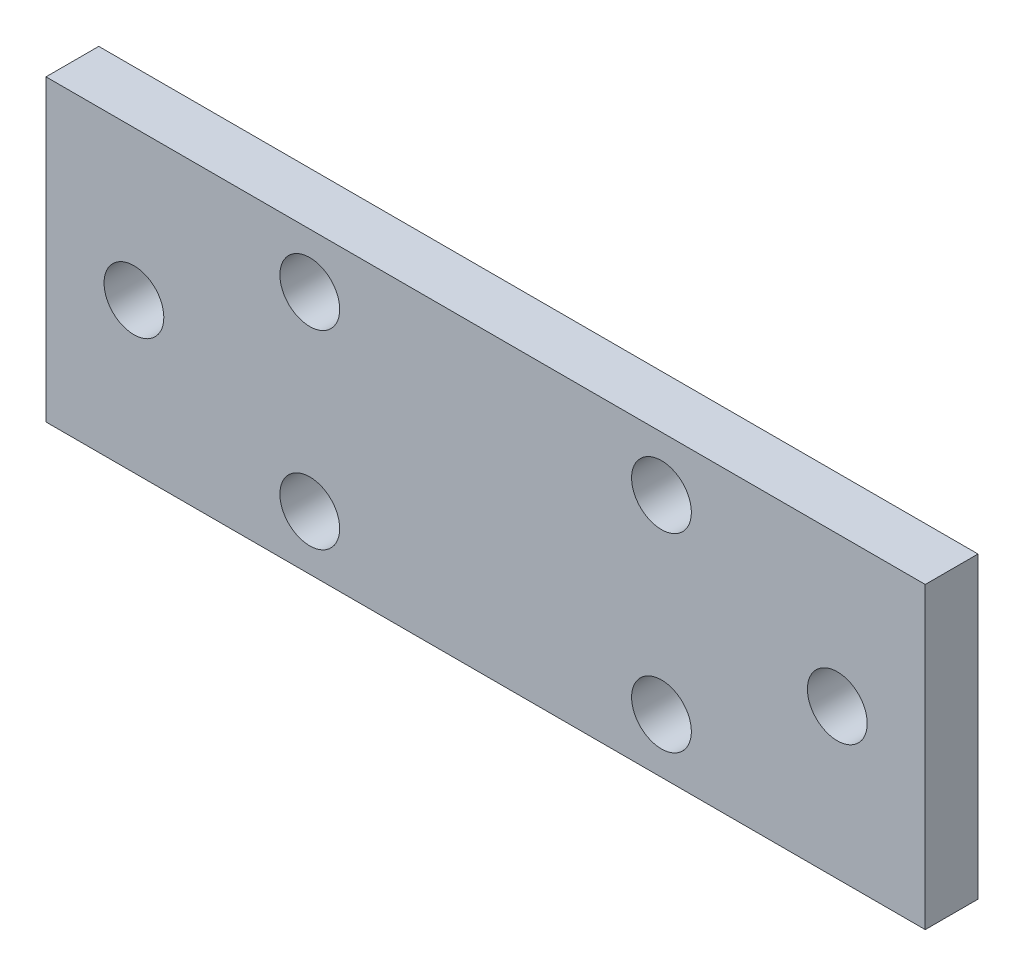
ISO-10303-21;
HEADER;
FILE_DESCRIPTION(('STEP AP214'),'2;1');
FILE_NAME('part.step','',(''),(''),'','','');
FILE_SCHEMA(('AUTOMOTIVE_DESIGN { 1 0 10303 214 1 1 1 1 }'));
ENDSEC;
DATA;
#1=APPLICATION_CONTEXT('core data for automotive mechanical design processes');
#2=APPLICATION_PROTOCOL_DEFINITION('international standard','automotive_design',2000,#1);
#3=PRODUCT_CONTEXT('',#1,'mechanical');
#4=PRODUCT('Part','Part','',(#3));
#5=PRODUCT_RELATED_PRODUCT_CATEGORY('part','',(#4));
#6=PRODUCT_DEFINITION_FORMATION('','',#4);
#7=PRODUCT_DEFINITION_CONTEXT('part definition',#1,'design');
#8=PRODUCT_DEFINITION('design','',#6,#7);
#9=PRODUCT_DEFINITION_SHAPE('','',#8);
#10=(LENGTH_UNIT() NAMED_UNIT(*) SI_UNIT(.MILLI.,.METRE.));
#11=(NAMED_UNIT(*) PLANE_ANGLE_UNIT() SI_UNIT($,.RADIAN.));
#12=(NAMED_UNIT(*) SI_UNIT($,.STERADIAN.) SOLID_ANGLE_UNIT());
#13=UNCERTAINTY_MEASURE_WITH_UNIT(LENGTH_MEASURE(1.E-05),#10,'distance_accuracy_value','');
#14=(GEOMETRIC_REPRESENTATION_CONTEXT(3) GLOBAL_UNCERTAINTY_ASSIGNED_CONTEXT((#13)) GLOBAL_UNIT_ASSIGNED_CONTEXT((#10,
#11,#12)) REPRESENTATION_CONTEXT('',''));
#15=CARTESIAN_POINT('',(0.,0.,0.));
#16=DIRECTION('',(0.,0.,1.));
#17=DIRECTION('',(1.,0.,0.));
#18=AXIS2_PLACEMENT_3D('',#15,#16,#17);
#19=CARTESIAN_POINT('',(-10.,5.4,1.5));
#20=DIRECTION('',(0.,0.,1.));
#21=DIRECTION('',(-1.,0.,0.));
#22=AXIS2_PLACEMENT_3D('',#19,#20,#21);
#23=CYLINDRICAL_SURFACE('',#22,1.7);
#24=CARTESIAN_POINT('',(-10.,5.4,-1.5));
#25=DIRECTION('',(0.,0.,1.));
#26=DIRECTION('',(-1.,0.,0.));
#27=AXIS2_PLACEMENT_3D('',#24,#25,#26);
#28=CIRCLE('',#27,1.7);
#29=CARTESIAN_POINT('',(-8.3,5.4,-1.5));
#30=VERTEX_POINT('',#29);
#31=EDGE_CURVE('E179',#30,#30,#28,.T.);
#32=ORIENTED_EDGE('',*,*,#31,.F.);
#33=DIRECTION('',(0.,0.,1.));
#34=VECTOR('',#33,1.);
#35=CARTESIAN_POINT('',(-8.3,5.4,1.5));
#36=LINE('',#35,#34);
#37=CARTESIAN_POINT('',(-8.3,5.4,1.5));
#38=VERTEX_POINT('',#37);
#39=EDGE_CURVE('E11',#30,#38,#36,.T.);
#40=ORIENTED_EDGE('',*,*,#39,.T.);
#41=CARTESIAN_POINT('',(-10.,5.4,1.5));
#42=DIRECTION('',(0.,0.,1.));
#43=DIRECTION('',(-1.,0.,0.));
#44=AXIS2_PLACEMENT_3D('',#41,#42,#43);
#45=CIRCLE('',#44,1.7);
#46=EDGE_CURVE('E201',#38,#38,#45,.T.);
#47=ORIENTED_EDGE('',*,*,#46,.T.);
#48=ORIENTED_EDGE('',*,*,#39,.F.);
#49=EDGE_LOOP('',(#32,#40,#47,#48));
#50=FACE_BOUND('',#49,.T.);
#51=ADVANCED_FACE('F17',(#50),#23,.F.);
#52=CARTESIAN_POINT('',(10.,5.4,1.5));
#53=DIRECTION('',(0.,0.,1.));
#54=DIRECTION('',(-1.,0.,0.));
#55=AXIS2_PLACEMENT_3D('',#52,#53,#54);
#56=CYLINDRICAL_SURFACE('',#55,1.7);
#57=CARTESIAN_POINT('',(10.,5.4,-1.5));
#58=DIRECTION('',(0.,0.,1.));
#59=DIRECTION('',(-1.,0.,0.));
#60=AXIS2_PLACEMENT_3D('',#57,#58,#59);
#61=CIRCLE('',#60,1.7);
#62=CARTESIAN_POINT('',(11.7,5.4,-1.5));
#63=VERTEX_POINT('',#62);
#64=EDGE_CURVE('E167',#63,#63,#61,.T.);
#65=ORIENTED_EDGE('',*,*,#64,.F.);
#66=DIRECTION('',(0.,0.,1.));
#67=VECTOR('',#66,1.);
#68=CARTESIAN_POINT('',(11.7,5.4,1.5));
#69=LINE('',#68,#67);
#70=CARTESIAN_POINT('',(11.7,5.4,1.5));
#71=VERTEX_POINT('',#70);
#72=EDGE_CURVE('E28',#63,#71,#69,.T.);
#73=ORIENTED_EDGE('',*,*,#72,.T.);
#74=CARTESIAN_POINT('',(10.,5.4,1.5));
#75=DIRECTION('',(0.,0.,1.));
#76=DIRECTION('',(-1.,0.,0.));
#77=AXIS2_PLACEMENT_3D('',#74,#75,#76);
#78=CIRCLE('',#77,1.7);
#79=EDGE_CURVE('E198',#71,#71,#78,.T.);
#80=ORIENTED_EDGE('',*,*,#79,.T.);
#81=ORIENTED_EDGE('',*,*,#72,.F.);
#82=EDGE_LOOP('',(#65,#73,#80,#81));
#83=FACE_BOUND('',#82,.T.);
#84=ADVANCED_FACE('F273',(#83),#56,.F.);
#85=CARTESIAN_POINT('',(-10.,-5.4,1.5));
#86=DIRECTION('',(0.,0.,-1.));
#87=DIRECTION('',(-1.,0.,0.));
#88=AXIS2_PLACEMENT_3D('',#85,#86,#87);
#89=CYLINDRICAL_SURFACE('',#88,1.7);
#90=CARTESIAN_POINT('',(-10.,-5.4,1.5));
#91=DIRECTION('',(0.,0.,-1.));
#92=DIRECTION('',(-1.,0.,0.));
#93=AXIS2_PLACEMENT_3D('',#90,#91,#92);
#94=CIRCLE('',#93,1.7);
#95=CARTESIAN_POINT('',(-8.3,-5.4,1.5));
#96=VERTEX_POINT('',#95);
#97=EDGE_CURVE('E197',#96,#96,#94,.T.);
#98=ORIENTED_EDGE('',*,*,#97,.F.);
#99=DIRECTION('',(0.,0.,-1.));
#100=VECTOR('',#99,1.);
#101=CARTESIAN_POINT('',(-8.3,-5.4,1.5));
#102=LINE('',#101,#100);
#103=CARTESIAN_POINT('',(-8.3,-5.4,-1.5));
#104=VERTEX_POINT('',#103);
#105=EDGE_CURVE('E21',#96,#104,#102,.T.);
#106=ORIENTED_EDGE('',*,*,#105,.T.);
#107=CARTESIAN_POINT('',(-10.,-5.4,-1.5));
#108=DIRECTION('',(0.,0.,-1.));
#109=DIRECTION('',(-1.,0.,0.));
#110=AXIS2_PLACEMENT_3D('',#107,#108,#109);
#111=CIRCLE('',#110,1.7);
#112=EDGE_CURVE('E163',#104,#104,#111,.T.);
#113=ORIENTED_EDGE('',*,*,#112,.T.);
#114=ORIENTED_EDGE('',*,*,#105,.F.);
#115=EDGE_LOOP('',(#98,#106,#113,#114));
#116=FACE_BOUND('',#115,.T.);
#117=ADVANCED_FACE('F277',(#116),#89,.F.);
#118=CARTESIAN_POINT('',(10.,-5.4,1.5));
#119=DIRECTION('',(0.,0.,-1.));
#120=DIRECTION('',(-1.,0.,0.));
#121=AXIS2_PLACEMENT_3D('',#118,#119,#120);
#122=CYLINDRICAL_SURFACE('',#121,1.7);
#123=CARTESIAN_POINT('',(10.,-5.4,1.5));
#124=DIRECTION('',(0.,0.,-1.));
#125=DIRECTION('',(-1.,0.,0.));
#126=AXIS2_PLACEMENT_3D('',#123,#124,#125);
#127=CIRCLE('',#126,1.7);
#128=CARTESIAN_POINT('',(11.7,-5.4,1.5));
#129=VERTEX_POINT('',#128);
#130=EDGE_CURVE('E142',#129,#129,#127,.T.);
#131=ORIENTED_EDGE('',*,*,#130,.F.);
#132=DIRECTION('',(0.,0.,-1.));
#133=VECTOR('',#132,1.);
#134=CARTESIAN_POINT('',(11.7,-5.4,1.5));
#135=LINE('',#134,#133);
#136=CARTESIAN_POINT('',(11.7,-5.4,-1.5));
#137=VERTEX_POINT('',#136);
#138=EDGE_CURVE('E123',#129,#137,#135,.T.);
#139=ORIENTED_EDGE('',*,*,#138,.T.);
#140=CARTESIAN_POINT('',(10.,-5.4,-1.5));
#141=DIRECTION('',(0.,0.,-1.));
#142=DIRECTION('',(-1.,0.,0.));
#143=AXIS2_PLACEMENT_3D('',#140,#141,#142);
#144=CIRCLE('',#143,1.7);
#145=EDGE_CURVE('E141',#137,#137,#144,.T.);
#146=ORIENTED_EDGE('',*,*,#145,.T.);
#147=ORIENTED_EDGE('',*,*,#138,.F.);
#148=EDGE_LOOP('',(#131,#139,#146,#147));
#149=FACE_BOUND('',#148,.T.);
#150=ADVANCED_FACE('F139',(#149),#122,.F.);
#151=CARTESIAN_POINT('',(-20.,0.,1.5));
#152=DIRECTION('',(0.,0.,-1.));
#153=DIRECTION('',(-1.,0.,0.));
#154=AXIS2_PLACEMENT_3D('',#151,#152,#153);
#155=CYLINDRICAL_SURFACE('',#154,1.7);
#156=CARTESIAN_POINT('',(-20.,0.,1.5));
#157=DIRECTION('',(0.,0.,-1.));
#158=DIRECTION('',(-1.,0.,0.));
#159=AXIS2_PLACEMENT_3D('',#156,#157,#158);
#160=CIRCLE('',#159,1.7);
#161=CARTESIAN_POINT('',(-18.3,0.,1.5));
#162=VERTEX_POINT('',#161);
#163=EDGE_CURVE('E152',#162,#162,#160,.T.);
#164=ORIENTED_EDGE('',*,*,#163,.F.);
#165=DIRECTION('',(0.,0.,-1.));
#166=VECTOR('',#165,1.);
#167=CARTESIAN_POINT('',(-18.3,0.,1.5));
#168=LINE('',#167,#166);
#169=CARTESIAN_POINT('',(-18.3,0.,-1.5));
#170=VERTEX_POINT('',#169);
#171=EDGE_CURVE('E135',#162,#170,#168,.T.);
#172=ORIENTED_EDGE('',*,*,#171,.T.);
#173=CARTESIAN_POINT('',(-20.,0.,-1.5));
#174=DIRECTION('',(0.,0.,-1.));
#175=DIRECTION('',(-1.,0.,0.));
#176=AXIS2_PLACEMENT_3D('',#173,#174,#175);
#177=CIRCLE('',#176,1.7);
#178=EDGE_CURVE('E159',#170,#170,#177,.T.);
#179=ORIENTED_EDGE('',*,*,#178,.T.);
#180=ORIENTED_EDGE('',*,*,#171,.F.);
#181=EDGE_LOOP('',(#164,#172,#179,#180));
#182=FACE_BOUND('',#181,.T.);
#183=ADVANCED_FACE('F268',(#182),#155,.F.);
#184=CARTESIAN_POINT('',(20.,0.,1.5));
#185=DIRECTION('',(0.,0.,-1.));
#186=DIRECTION('',(-1.,0.,0.));
#187=AXIS2_PLACEMENT_3D('',#184,#185,#186);
#188=CYLINDRICAL_SURFACE('',#187,1.7);
#189=CARTESIAN_POINT('',(20.,0.,1.5));
#190=DIRECTION('',(0.,0.,-1.));
#191=DIRECTION('',(-1.,0.,0.));
#192=AXIS2_PLACEMENT_3D('',#189,#190,#191);
#193=CIRCLE('',#192,1.7);
#194=CARTESIAN_POINT('',(21.7,0.,1.5));
#195=VERTEX_POINT('',#194);
#196=EDGE_CURVE('E155',#195,#195,#193,.T.);
#197=ORIENTED_EDGE('',*,*,#196,.F.);
#198=DIRECTION('',(0.,0.,-1.));
#199=VECTOR('',#198,1.);
#200=CARTESIAN_POINT('',(21.7,0.,1.5));
#201=LINE('',#200,#199);
#202=CARTESIAN_POINT('',(21.7,0.,-1.5));
#203=VERTEX_POINT('',#202);
#204=EDGE_CURVE('E149',#195,#203,#201,.T.);
#205=ORIENTED_EDGE('',*,*,#204,.T.);
#206=CARTESIAN_POINT('',(20.,0.,-1.5));
#207=DIRECTION('',(0.,0.,-1.));
#208=DIRECTION('',(-1.,0.,0.));
#209=AXIS2_PLACEMENT_3D('',#206,#207,#208);
#210=CIRCLE('',#209,1.7);
#211=EDGE_CURVE('E162',#203,#203,#210,.T.);
#212=ORIENTED_EDGE('',*,*,#211,.T.);
#213=ORIENTED_EDGE('',*,*,#204,.F.);
#214=EDGE_LOOP('',(#197,#205,#212,#213));
#215=FACE_BOUND('',#214,.T.);
#216=ADVANCED_FACE('F240',(#215),#188,.F.);
#217=CARTESIAN_POINT('',(0.,0.,1.5));
#218=DIRECTION('',(0.,0.,1.));
#219=DIRECTION('',(1.,0.,0.));
#220=AXIS2_PLACEMENT_3D('',#217,#218,#219);
#221=PLANE('',#220);
#222=ORIENTED_EDGE('',*,*,#46,.F.);
#223=EDGE_LOOP('',(#222));
#224=FACE_BOUND('',#223,.T.);
#225=ORIENTED_EDGE('',*,*,#79,.F.);
#226=EDGE_LOOP('',(#225));
#227=FACE_BOUND('',#226,.T.);
#228=ORIENTED_EDGE('',*,*,#97,.T.);
#229=EDGE_LOOP('',(#228));
#230=FACE_BOUND('',#229,.T.);
#231=ORIENTED_EDGE('',*,*,#130,.T.);
#232=EDGE_LOOP('',(#231));
#233=FACE_BOUND('',#232,.T.);
#234=ORIENTED_EDGE('',*,*,#163,.T.);
#235=EDGE_LOOP('',(#234));
#236=FACE_BOUND('',#235,.T.);
#237=ORIENTED_EDGE('',*,*,#196,.T.);
#238=EDGE_LOOP('',(#237));
#239=FACE_BOUND('',#238,.T.);
#240=DIRECTION('',(0.,-1.,0.));
#241=VECTOR('',#240,1.);
#242=CARTESIAN_POINT('',(-25.,8.5,1.5));
#243=LINE('',#242,#241);
#244=CARTESIAN_POINT('',(-25.,8.5,1.5));
#245=VERTEX_POINT('',#244);
#246=CARTESIAN_POINT('',(-25.,-8.5,1.5));
#247=VERTEX_POINT('',#246);
#248=EDGE_CURVE('E174',#245,#247,#243,.T.);
#249=ORIENTED_EDGE('',*,*,#248,.T.);
#250=DIRECTION('',(1.,0.,0.));
#251=VECTOR('',#250,1.);
#252=CARTESIAN_POINT('',(-25.,-8.5,1.5));
#253=LINE('',#252,#251);
#254=CARTESIAN_POINT('',(25.,-8.5,1.5));
#255=VERTEX_POINT('',#254);
#256=EDGE_CURVE('E101',#247,#255,#253,.T.);
#257=ORIENTED_EDGE('',*,*,#256,.T.);
#258=DIRECTION('',(0.,1.,0.));
#259=VECTOR('',#258,1.);
#260=CARTESIAN_POINT('',(25.,-8.5,1.5));
#261=LINE('',#260,#259);
#262=CARTESIAN_POINT('',(25.,8.5,1.5));
#263=VERTEX_POINT('',#262);
#264=EDGE_CURVE('E93',#255,#263,#261,.T.);
#265=ORIENTED_EDGE('',*,*,#264,.T.);
#266=DIRECTION('',(-1.,0.,0.));
#267=VECTOR('',#266,1.);
#268=CARTESIAN_POINT('',(25.,8.5,1.5));
#269=LINE('',#268,#267);
#270=EDGE_CURVE('E86',#263,#245,#269,.T.);
#271=ORIENTED_EDGE('',*,*,#270,.T.);
#272=EDGE_LOOP('',(#249,#257,#265,#271));
#273=FACE_BOUND('',#272,.T.);
#274=ADVANCED_FACE('F238',(#224,#227,#230,#233,#236,#239,#273),#221,.T.);
#275=CARTESIAN_POINT('',(-25.,-8.5,-1.5));
#276=DIRECTION('',(0.,-1.,0.));
#277=DIRECTION('',(0.,0.,-1.));
#278=AXIS2_PLACEMENT_3D('',#275,#276,#277);
#279=PLANE('',#278);
#280=DIRECTION('',(1.,0.,0.));
#281=VECTOR('',#280,1.);
#282=CARTESIAN_POINT('',(-25.,-8.5,-1.5));
#283=LINE('',#282,#281);
#284=CARTESIAN_POINT('',(-25.,-8.5,-1.5));
#285=VERTEX_POINT('',#284);
#286=CARTESIAN_POINT('',(25.,-8.5,-1.5));
#287=VERTEX_POINT('',#286);
#288=EDGE_CURVE('E173',#285,#287,#283,.T.);
#289=ORIENTED_EDGE('',*,*,#288,.T.);
#290=DIRECTION('',(0.,0.,1.));
#291=VECTOR('',#290,1.);
#292=CARTESIAN_POINT('',(25.,-8.5,-1.5));
#293=LINE('',#292,#291);
#294=EDGE_CURVE('E156',#287,#255,#293,.T.);
#295=ORIENTED_EDGE('',*,*,#294,.T.);
#296=ORIENTED_EDGE('',*,*,#256,.F.);
#297=DIRECTION('',(0.,0.,1.));
#298=VECTOR('',#297,1.);
#299=CARTESIAN_POINT('',(-25.,-8.5,-1.5));
#300=LINE('',#299,#298);
#301=EDGE_CURVE('E178',#285,#247,#300,.T.);
#302=ORIENTED_EDGE('',*,*,#301,.F.);
#303=EDGE_LOOP('',(#289,#295,#296,#302));
#304=FACE_BOUND('',#303,.T.);
#305=ADVANCED_FACE('F258',(#304),#279,.T.);
#306=CARTESIAN_POINT('',(25.,-8.5,-1.5));
#307=DIRECTION('',(1.,0.,0.));
#308=DIRECTION('',(0.,1.,0.));
#309=AXIS2_PLACEMENT_3D('',#306,#307,#308);
#310=PLANE('',#309);
#311=DIRECTION('',(0.,1.,0.));
#312=VECTOR('',#311,1.);
#313=CARTESIAN_POINT('',(25.,-8.5,-1.5));
#314=LINE('',#313,#312);
#315=CARTESIAN_POINT('',(25.,8.5,-1.5));
#316=VERTEX_POINT('',#315);
#317=EDGE_CURVE('E188',#287,#316,#314,.T.);
#318=ORIENTED_EDGE('',*,*,#317,.T.);
#319=DIRECTION('',(0.,0.,1.));
#320=VECTOR('',#319,1.);
#321=CARTESIAN_POINT('',(25.,8.5,-1.5));
#322=LINE('',#321,#320);
#323=EDGE_CURVE('E217',#316,#263,#322,.T.);
#324=ORIENTED_EDGE('',*,*,#323,.T.);
#325=ORIENTED_EDGE('',*,*,#264,.F.);
#326=ORIENTED_EDGE('',*,*,#294,.F.);
#327=EDGE_LOOP('',(#318,#324,#325,#326));
#328=FACE_BOUND('',#327,.T.);
#329=ADVANCED_FACE('F256',(#328),#310,.T.);
#330=CARTESIAN_POINT('',(25.,8.5,-1.5));
#331=DIRECTION('',(0.,1.,0.));
#332=DIRECTION('',(1.,0.,0.));
#333=AXIS2_PLACEMENT_3D('',#330,#331,#332);
#334=PLANE('',#333);
#335=DIRECTION('',(-1.,0.,0.));
#336=VECTOR('',#335,1.);
#337=CARTESIAN_POINT('',(25.,8.5,-1.5));
#338=LINE('',#337,#336);
#339=CARTESIAN_POINT('',(-25.,8.5,-1.5));
#340=VERTEX_POINT('',#339);
#341=EDGE_CURVE('E192',#316,#340,#338,.T.);
#342=ORIENTED_EDGE('',*,*,#341,.T.);
#343=DIRECTION('',(0.,0.,1.));
#344=VECTOR('',#343,1.);
#345=CARTESIAN_POINT('',(-25.,8.5,-1.5));
#346=LINE('',#345,#344);
#347=EDGE_CURVE('E177',#340,#245,#346,.T.);
#348=ORIENTED_EDGE('',*,*,#347,.T.);
#349=ORIENTED_EDGE('',*,*,#270,.F.);
#350=ORIENTED_EDGE('',*,*,#323,.F.);
#351=EDGE_LOOP('',(#342,#348,#349,#350));
#352=FACE_BOUND('',#351,.T.);
#353=ADVANCED_FACE('F254',(#352),#334,.T.);
#354=CARTESIAN_POINT('',(-25.,8.5,-1.5));
#355=DIRECTION('',(-1.,0.,0.));
#356=DIRECTION('',(0.,0.,1.));
#357=AXIS2_PLACEMENT_3D('',#354,#355,#356);
#358=PLANE('',#357);
#359=DIRECTION('',(0.,-1.,0.));
#360=VECTOR('',#359,1.);
#361=CARTESIAN_POINT('',(-25.,8.5,-1.5));
#362=LINE('',#361,#360);
#363=EDGE_CURVE('E209',#340,#285,#362,.T.);
#364=ORIENTED_EDGE('',*,*,#363,.T.);
#365=ORIENTED_EDGE('',*,*,#301,.T.);
#366=ORIENTED_EDGE('',*,*,#248,.F.);
#367=ORIENTED_EDGE('',*,*,#347,.F.);
#368=EDGE_LOOP('',(#364,#365,#366,#367));
#369=FACE_BOUND('',#368,.T.);
#370=ADVANCED_FACE('F245',(#369),#358,.T.);
#371=CARTESIAN_POINT('',(0.,0.,-1.5));
#372=DIRECTION('',(0.,0.,1.));
#373=DIRECTION('',(1.,0.,0.));
#374=AXIS2_PLACEMENT_3D('',#371,#372,#373);
#375=PLANE('',#374);
#376=ORIENTED_EDGE('',*,*,#31,.T.);
#377=EDGE_LOOP('',(#376));
#378=FACE_BOUND('',#377,.T.);
#379=ORIENTED_EDGE('',*,*,#64,.T.);
#380=EDGE_LOOP('',(#379));
#381=FACE_BOUND('',#380,.T.);
#382=ORIENTED_EDGE('',*,*,#112,.F.);
#383=EDGE_LOOP('',(#382));
#384=FACE_BOUND('',#383,.T.);
#385=ORIENTED_EDGE('',*,*,#145,.F.);
#386=EDGE_LOOP('',(#385));
#387=FACE_BOUND('',#386,.T.);
#388=ORIENTED_EDGE('',*,*,#178,.F.);
#389=EDGE_LOOP('',(#388));
#390=FACE_BOUND('',#389,.T.);
#391=ORIENTED_EDGE('',*,*,#211,.F.);
#392=EDGE_LOOP('',(#391));
#393=FACE_BOUND('',#392,.T.);
#394=ORIENTED_EDGE('',*,*,#363,.F.);
#395=ORIENTED_EDGE('',*,*,#341,.F.);
#396=ORIENTED_EDGE('',*,*,#317,.F.);
#397=ORIENTED_EDGE('',*,*,#288,.F.);
#398=EDGE_LOOP('',(#394,#395,#396,#397));
#399=FACE_BOUND('',#398,.T.);
#400=ADVANCED_FACE('F19',(#378,#381,#384,#387,#390,#393,#399),#375,.F.);
#401=CLOSED_SHELL('',(#51,#84,#117,#150,#183,#216,#274,#305,#329,#353,#370,#400));
#402=MANIFOLD_SOLID_BREP('B1',#401);
#403=ADVANCED_BREP_SHAPE_REPRESENTATION('',(#18,#402),#14);
#404=SHAPE_DEFINITION_REPRESENTATION(#9,#403);
ENDSEC;
END-ISO-10303-21;
